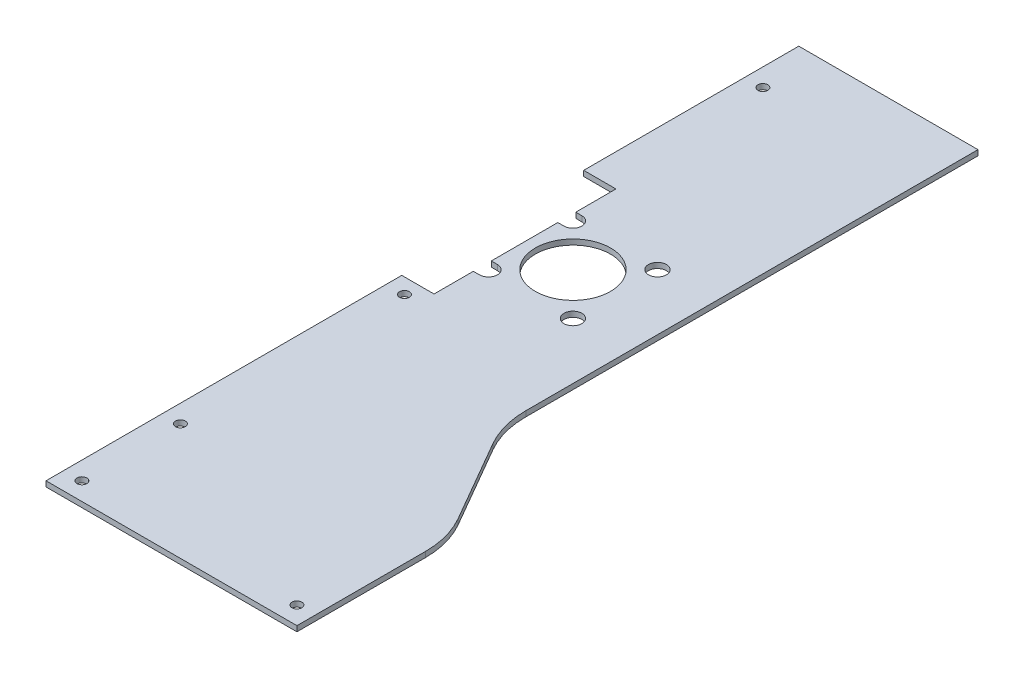
ISO-10303-21;
HEADER;
FILE_DESCRIPTION(('STEP AP214'),'2;1');
FILE_NAME('part.step','',(''),(''),'','','');
FILE_SCHEMA(('AUTOMOTIVE_DESIGN { 1 0 10303 214 1 1 1 1 }'));
ENDSEC;
DATA;
#1=APPLICATION_CONTEXT('core data for automotive mechanical design processes');
#2=APPLICATION_PROTOCOL_DEFINITION('international standard','automotive_design',2000,#1);
#3=PRODUCT_CONTEXT('',#1,'mechanical');
#4=PRODUCT('Part','Part','',(#3));
#5=PRODUCT_RELATED_PRODUCT_CATEGORY('part','',(#4));
#6=PRODUCT_DEFINITION_FORMATION('','',#4);
#7=PRODUCT_DEFINITION_CONTEXT('part definition',#1,'design');
#8=PRODUCT_DEFINITION('design','',#6,#7);
#9=PRODUCT_DEFINITION_SHAPE('','',#8);
#10=(LENGTH_UNIT() NAMED_UNIT(*) SI_UNIT(.MILLI.,.METRE.));
#11=(NAMED_UNIT(*) PLANE_ANGLE_UNIT() SI_UNIT($,.RADIAN.));
#12=(NAMED_UNIT(*) SI_UNIT($,.STERADIAN.) SOLID_ANGLE_UNIT());
#13=UNCERTAINTY_MEASURE_WITH_UNIT(LENGTH_MEASURE(1.E-05),#10,'distance_accuracy_value','');
#14=(GEOMETRIC_REPRESENTATION_CONTEXT(3) GLOBAL_UNCERTAINTY_ASSIGNED_CONTEXT((#13)) GLOBAL_UNIT_ASSIGNED_CONTEXT((#10,
#11,#12)) REPRESENTATION_CONTEXT('',''));
#15=CARTESIAN_POINT('',(0.,0.,0.));
#16=DIRECTION('',(0.,0.,1.));
#17=DIRECTION('',(1.,0.,0.));
#18=AXIS2_PLACEMENT_3D('',#15,#16,#17);
#19=CARTESIAN_POINT('',(95.6984536095886,39.4297055458415,20.3890320920176));
#20=DIRECTION('',(0.,1.,0.));
#21=DIRECTION('',(1.,0.,0.));
#22=AXIS2_PLACEMENT_3D('',#19,#20,#21);
#23=CYLINDRICAL_SURFACE('',#22,5.);
#24=CARTESIAN_POINT('',(95.6984536095886,42.4297055458415,20.3890320920176));
#25=DIRECTION('',(0.,1.,0.));
#26=DIRECTION('',(-1.,0.,0.));
#27=AXIS2_PLACEMENT_3D('',#24,#25,#26);
#28=CIRCLE('',#27,5.);
#29=CARTESIAN_POINT('',(95.6984536095886,42.4297055458415,25.3890320920178));
#30=VERTEX_POINT('',#29);
#31=CARTESIAN_POINT('',(95.6984536095886,42.4297055458415,15.3890320920174));
#32=VERTEX_POINT('',#31);
#33=EDGE_CURVE('E179',#30,#32,#28,.T.);
#34=ORIENTED_EDGE('',*,*,#33,.T.);
#35=DIRECTION('',(0.,-1.,0.));
#36=VECTOR('',#35,1.);
#37=CARTESIAN_POINT('',(95.6984536095886,42.4297055458415,15.3890320920174));
#38=LINE('',#37,#36);
#39=CARTESIAN_POINT('',(95.6984536095886,39.4297055458415,15.3890320920174));
#40=VERTEX_POINT('',#39);
#41=EDGE_CURVE('E840',#32,#40,#38,.T.);
#42=ORIENTED_EDGE('',*,*,#41,.T.);
#43=CARTESIAN_POINT('',(95.6984536095886,39.4297055458415,20.3890320920176));
#44=DIRECTION('',(0.,1.,0.));
#45=DIRECTION('',(-1.,0.,0.));
#46=AXIS2_PLACEMENT_3D('',#43,#44,#45);
#47=CIRCLE('',#46,5.);
#48=CARTESIAN_POINT('',(95.6984536095886,39.4297055458415,25.3890320920178));
#49=VERTEX_POINT('',#48);
#50=EDGE_CURVE('E313',#49,#40,#47,.T.);
#51=ORIENTED_EDGE('',*,*,#50,.F.);
#52=DIRECTION('',(0.,-1.,0.));
#53=VECTOR('',#52,1.);
#54=CARTESIAN_POINT('',(95.6984536095886,42.4297055458415,25.3890320920178));
#55=LINE('',#54,#53);
#56=EDGE_CURVE('E830',#30,#49,#55,.T.);
#57=ORIENTED_EDGE('',*,*,#56,.F.);
#58=EDGE_LOOP('',(#34,#42,#51,#57));
#59=FACE_BOUND('',#58,.T.);
#60=ADVANCED_FACE('F17',(#59),#23,.F.);
#61=CARTESIAN_POINT('',(95.6984536095886,39.4297055458415,67.5290320920176));
#62=DIRECTION('',(0.,1.,0.));
#63=DIRECTION('',(1.,0.,0.));
#64=AXIS2_PLACEMENT_3D('',#61,#62,#63);
#65=CYLINDRICAL_SURFACE('',#64,5.);
#66=CARTESIAN_POINT('',(95.6984536095886,42.4297055458415,67.5290320920176));
#67=DIRECTION('',(0.,1.,0.));
#68=DIRECTION('',(-1.,0.,0.));
#69=AXIS2_PLACEMENT_3D('',#66,#67,#68);
#70=CIRCLE('',#69,5.);
#71=CARTESIAN_POINT('',(95.6984536095886,42.4297055458415,72.5290320920177));
#72=VERTEX_POINT('',#71);
#73=CARTESIAN_POINT('',(95.6984536095886,42.4297055458415,62.5290320920175));
#74=VERTEX_POINT('',#73);
#75=EDGE_CURVE('E168',#72,#74,#70,.T.);
#76=ORIENTED_EDGE('',*,*,#75,.T.);
#77=DIRECTION('',(0.,-1.,0.));
#78=VECTOR('',#77,1.);
#79=CARTESIAN_POINT('',(95.6984536095886,42.4297055458415,62.5290320920175));
#80=LINE('',#79,#78);
#81=CARTESIAN_POINT('',(95.6984536095886,39.4297055458415,62.5290320920175));
#82=VERTEX_POINT('',#81);
#83=EDGE_CURVE('E41',#74,#82,#80,.T.);
#84=ORIENTED_EDGE('',*,*,#83,.T.);
#85=CARTESIAN_POINT('',(95.6984536095886,39.4297055458415,67.5290320920176));
#86=DIRECTION('',(0.,1.,0.));
#87=DIRECTION('',(-1.,0.,0.));
#88=AXIS2_PLACEMENT_3D('',#85,#86,#87);
#89=CIRCLE('',#88,5.);
#90=CARTESIAN_POINT('',(95.6984536095886,39.4297055458415,72.5290320920177));
#91=VERTEX_POINT('',#90);
#92=EDGE_CURVE('E170',#91,#82,#89,.T.);
#93=ORIENTED_EDGE('',*,*,#92,.F.);
#94=DIRECTION('',(0.,-1.,0.));
#95=VECTOR('',#94,1.);
#96=CARTESIAN_POINT('',(95.6984536095886,42.4297055458415,72.5290320920177));
#97=LINE('',#96,#95);
#98=EDGE_CURVE('E155',#72,#91,#97,.T.);
#99=ORIENTED_EDGE('',*,*,#98,.F.);
#100=EDGE_LOOP('',(#76,#84,#93,#99));
#101=FACE_BOUND('',#100,.T.);
#102=ADVANCED_FACE('F167',(#101),#65,.F.);
#103=CARTESIAN_POINT('',(204.268453609589,39.4297055458415,282.959032092008));
#104=DIRECTION('',(0.,1.,0.));
#105=DIRECTION('',(1.,0.,0.));
#106=AXIS2_PLACEMENT_3D('',#103,#104,#105);
#107=CYLINDRICAL_SURFACE('',#106,2.75);
#108=CARTESIAN_POINT('',(204.268453609589,39.4297055458415,282.959032092008));
#109=DIRECTION('',(0.,-1.,0.));
#110=DIRECTION('',(-1.,0.,0.));
#111=AXIS2_PLACEMENT_3D('',#108,#109,#110);
#112=CIRCLE('',#111,2.75);
#113=CARTESIAN_POINT('',(201.518453609589,39.4297055458415,282.959032092008));
#114=VERTEX_POINT('',#113);
#115=EDGE_CURVE('E859',#114,#114,#112,.T.);
#116=ORIENTED_EDGE('',*,*,#115,.T.);
#117=EDGE_LOOP('',(#116));
#118=FACE_BOUND('',#117,.T.);
#119=CARTESIAN_POINT('',(204.268453609589,42.4297055458415,282.959032092008));
#120=DIRECTION('',(0.,-1.,0.));
#121=DIRECTION('',(-1.,0.,0.));
#122=AXIS2_PLACEMENT_3D('',#119,#120,#121);
#123=CIRCLE('',#122,2.75);
#124=CARTESIAN_POINT('',(201.518453609589,42.4297055458415,282.959032092008));
#125=VERTEX_POINT('',#124);
#126=EDGE_CURVE('E845',#125,#125,#123,.T.);
#127=ORIENTED_EDGE('',*,*,#126,.F.);
#128=EDGE_LOOP('',(#127));
#129=FACE_BOUND('',#128,.T.);
#130=ADVANCED_FACE('F400',(#118,#129),#107,.F.);
#131=CARTESIAN_POINT('',(84.2684536095885,39.4297055458415,282.959032092008));
#132=DIRECTION('',(0.,1.,0.));
#133=DIRECTION('',(1.,0.,0.));
#134=AXIS2_PLACEMENT_3D('',#131,#132,#133);
#135=CYLINDRICAL_SURFACE('',#134,2.75);
#136=CARTESIAN_POINT('',(84.2684536095885,39.4297055458415,282.959032092008));
#137=DIRECTION('',(0.,-1.,0.));
#138=DIRECTION('',(-1.,0.,0.));
#139=AXIS2_PLACEMENT_3D('',#136,#137,#138);
#140=CIRCLE('',#139,2.75);
#141=CARTESIAN_POINT('',(81.5184536095885,39.4297055458415,282.959032092008));
#142=VERTEX_POINT('',#141);
#143=EDGE_CURVE('E867',#142,#142,#140,.T.);
#144=ORIENTED_EDGE('',*,*,#143,.T.);
#145=EDGE_LOOP('',(#144));
#146=FACE_BOUND('',#145,.T.);
#147=CARTESIAN_POINT('',(84.2684536095885,42.4297055458415,282.959032092008));
#148=DIRECTION('',(0.,-1.,0.));
#149=DIRECTION('',(-1.,0.,0.));
#150=AXIS2_PLACEMENT_3D('',#147,#148,#149);
#151=CIRCLE('',#150,2.75);
#152=CARTESIAN_POINT('',(81.5184536095885,42.4297055458415,282.959032092008));
#153=VERTEX_POINT('',#152);
#154=EDGE_CURVE('E863',#153,#153,#151,.T.);
#155=ORIENTED_EDGE('',*,*,#154,.F.);
#156=EDGE_LOOP('',(#155));
#157=FACE_BOUND('',#156,.T.);
#158=ADVANCED_FACE('F572',(#146,#157),#135,.F.);
#159=CARTESIAN_POINT('',(84.2684536095885,39.4297055458415,227.959032092009));
#160=DIRECTION('',(0.,1.,0.));
#161=DIRECTION('',(1.,0.,0.));
#162=AXIS2_PLACEMENT_3D('',#159,#160,#161);
#163=CYLINDRICAL_SURFACE('',#162,2.75);
#164=CARTESIAN_POINT('',(84.2684536095885,39.4297055458415,227.959032092009));
#165=DIRECTION('',(0.,-1.,0.));
#166=DIRECTION('',(-1.,0.,0.));
#167=AXIS2_PLACEMENT_3D('',#164,#165,#166);
#168=CIRCLE('',#167,2.75);
#169=CARTESIAN_POINT('',(81.5184536095885,39.4297055458415,227.959032092009));
#170=VERTEX_POINT('',#169);
#171=EDGE_CURVE('E875',#170,#170,#168,.T.);
#172=ORIENTED_EDGE('',*,*,#171,.T.);
#173=EDGE_LOOP('',(#172));
#174=FACE_BOUND('',#173,.T.);
#175=CARTESIAN_POINT('',(84.2684536095885,42.4297055458415,227.959032092009));
#176=DIRECTION('',(0.,-1.,0.));
#177=DIRECTION('',(-1.,0.,0.));
#178=AXIS2_PLACEMENT_3D('',#175,#176,#177);
#179=CIRCLE('',#178,2.75);
#180=CARTESIAN_POINT('',(81.5184536095885,42.4297055458415,227.959032092009));
#181=VERTEX_POINT('',#180);
#182=EDGE_CURVE('E871',#181,#181,#179,.T.);
#183=ORIENTED_EDGE('',*,*,#182,.F.);
#184=EDGE_LOOP('',(#183));
#185=FACE_BOUND('',#184,.T.);
#186=ADVANCED_FACE('F584',(#174,#185),#163,.F.);
#187=CARTESIAN_POINT('',(84.2684536095885,39.4297055458415,102.959032092009));
#188=DIRECTION('',(0.,1.,0.));
#189=DIRECTION('',(1.,0.,0.));
#190=AXIS2_PLACEMENT_3D('',#187,#188,#189);
#191=CYLINDRICAL_SURFACE('',#190,2.75);
#192=CARTESIAN_POINT('',(84.2684536095885,39.4297055458415,102.959032092009));
#193=DIRECTION('',(0.,-1.,0.));
#194=DIRECTION('',(-1.,0.,0.));
#195=AXIS2_PLACEMENT_3D('',#192,#193,#194);
#196=CIRCLE('',#195,2.75);
#197=CARTESIAN_POINT('',(81.5184536095885,39.4297055458415,102.959032092009));
#198=VERTEX_POINT('',#197);
#199=EDGE_CURVE('E883',#198,#198,#196,.T.);
#200=ORIENTED_EDGE('',*,*,#199,.T.);
#201=EDGE_LOOP('',(#200));
#202=FACE_BOUND('',#201,.T.);
#203=CARTESIAN_POINT('',(84.2684536095885,42.4297055458415,102.959032092009));
#204=DIRECTION('',(0.,-1.,0.));
#205=DIRECTION('',(-1.,0.,0.));
#206=AXIS2_PLACEMENT_3D('',#203,#204,#205);
#207=CIRCLE('',#206,2.75);
#208=CARTESIAN_POINT('',(81.5184536095885,42.4297055458415,102.959032092009));
#209=VERTEX_POINT('',#208);
#210=EDGE_CURVE('E879',#209,#209,#207,.T.);
#211=ORIENTED_EDGE('',*,*,#210,.F.);
#212=EDGE_LOOP('',(#211));
#213=FACE_BOUND('',#212,.T.);
#214=ADVANCED_FACE('F597',(#202,#213),#191,.F.);
#215=CARTESIAN_POINT('',(84.2684536095885,39.4297055458415,-97.0409679079914));
#216=DIRECTION('',(0.,1.,0.));
#217=DIRECTION('',(1.,0.,0.));
#218=AXIS2_PLACEMENT_3D('',#215,#216,#217);
#219=CYLINDRICAL_SURFACE('',#218,2.75000000000004);
#220=CARTESIAN_POINT('',(84.2684536095885,39.4297055458415,-97.0409679079914));
#221=DIRECTION('',(0.,-1.,0.));
#222=DIRECTION('',(-1.,0.,0.));
#223=AXIS2_PLACEMENT_3D('',#220,#221,#222);
#224=CIRCLE('',#223,2.75000000000004);
#225=CARTESIAN_POINT('',(81.5184536095885,39.4297055458415,-97.0409679079914));
#226=VERTEX_POINT('',#225);
#227=EDGE_CURVE('E891',#226,#226,#224,.T.);
#228=ORIENTED_EDGE('',*,*,#227,.T.);
#229=EDGE_LOOP('',(#228));
#230=FACE_BOUND('',#229,.T.);
#231=CARTESIAN_POINT('',(84.2684536095885,42.4297055458415,-97.0409679079914));
#232=DIRECTION('',(0.,-1.,0.));
#233=DIRECTION('',(-1.,0.,0.));
#234=AXIS2_PLACEMENT_3D('',#231,#232,#233);
#235=CIRCLE('',#234,2.75000000000004);
#236=CARTESIAN_POINT('',(81.5184536095885,42.4297055458415,-97.0409679079914));
#237=VERTEX_POINT('',#236);
#238=EDGE_CURVE('E887',#237,#237,#235,.T.);
#239=ORIENTED_EDGE('',*,*,#238,.F.);
#240=EDGE_LOOP('',(#239));
#241=FACE_BOUND('',#240,.T.);
#242=ADVANCED_FACE('F610',(#230,#241),#219,.F.);
#243=CARTESIAN_POINT('',(142.838453609589,39.4297055458415,20.3890320920176));
#244=DIRECTION('',(0.,1.,0.));
#245=DIRECTION('',(1.,0.,0.));
#246=AXIS2_PLACEMENT_3D('',#243,#244,#245);
#247=CYLINDRICAL_SURFACE('',#246,5.);
#248=CARTESIAN_POINT('',(142.838453609589,39.4297055458415,20.3890320920176));
#249=DIRECTION('',(0.,-1.,0.));
#250=DIRECTION('',(-1.,0.,0.));
#251=AXIS2_PLACEMENT_3D('',#248,#249,#250);
#252=CIRCLE('',#251,5.);
#253=CARTESIAN_POINT('',(137.838453609589,39.4297055458415,20.3890320920176));
#254=VERTEX_POINT('',#253);
#255=EDGE_CURVE('E899',#254,#254,#252,.T.);
#256=ORIENTED_EDGE('',*,*,#255,.T.);
#257=EDGE_LOOP('',(#256));
#258=FACE_BOUND('',#257,.T.);
#259=CARTESIAN_POINT('',(142.838453609589,42.4297055458415,20.3890320920176));
#260=DIRECTION('',(0.,-1.,0.));
#261=DIRECTION('',(-1.,0.,0.));
#262=AXIS2_PLACEMENT_3D('',#259,#260,#261);
#263=CIRCLE('',#262,5.);
#264=CARTESIAN_POINT('',(137.838453609589,42.4297055458415,20.3890320920176));
#265=VERTEX_POINT('',#264);
#266=EDGE_CURVE('E895',#265,#265,#263,.T.);
#267=ORIENTED_EDGE('',*,*,#266,.F.);
#268=EDGE_LOOP('',(#267));
#269=FACE_BOUND('',#268,.T.);
#270=ADVANCED_FACE('F622',(#258,#269),#247,.F.);
#271=CARTESIAN_POINT('',(142.838453609589,39.4297055458415,67.5290320920176));
#272=DIRECTION('',(0.,1.,0.));
#273=DIRECTION('',(1.,0.,0.));
#274=AXIS2_PLACEMENT_3D('',#271,#272,#273);
#275=CYLINDRICAL_SURFACE('',#274,5.);
#276=CARTESIAN_POINT('',(142.838453609589,39.4297055458415,67.5290320920176));
#277=DIRECTION('',(0.,-1.,0.));
#278=DIRECTION('',(-1.,0.,0.));
#279=AXIS2_PLACEMENT_3D('',#276,#277,#278);
#280=CIRCLE('',#279,5.);
#281=CARTESIAN_POINT('',(137.838453609589,39.4297055458415,67.5290320920176));
#282=VERTEX_POINT('',#281);
#283=EDGE_CURVE('E907',#282,#282,#280,.T.);
#284=ORIENTED_EDGE('',*,*,#283,.T.);
#285=EDGE_LOOP('',(#284));
#286=FACE_BOUND('',#285,.T.);
#287=CARTESIAN_POINT('',(142.838453609589,42.4297055458415,67.5290320920176));
#288=DIRECTION('',(0.,-1.,0.));
#289=DIRECTION('',(-1.,0.,0.));
#290=AXIS2_PLACEMENT_3D('',#287,#288,#289);
#291=CIRCLE('',#290,5.);
#292=CARTESIAN_POINT('',(137.838453609589,42.4297055458415,67.5290320920176));
#293=VERTEX_POINT('',#292);
#294=EDGE_CURVE('E903',#293,#293,#291,.T.);
#295=ORIENTED_EDGE('',*,*,#294,.F.);
#296=EDGE_LOOP('',(#295));
#297=FACE_BOUND('',#296,.T.);
#298=ADVANCED_FACE('F633',(#286,#297),#275,.F.);
#299=CARTESIAN_POINT('',(119.268453609589,39.4297055458415,43.9590320920176));
#300=DIRECTION('',(0.,1.,0.));
#301=DIRECTION('',(1.,0.,0.));
#302=AXIS2_PLACEMENT_3D('',#299,#300,#301);
#303=CYLINDRICAL_SURFACE('',#302,21.);
#304=CARTESIAN_POINT('',(119.268453609589,39.4297055458415,43.9590320920176));
#305=DIRECTION('',(0.,-1.,0.));
#306=DIRECTION('',(-1.,0.,0.));
#307=AXIS2_PLACEMENT_3D('',#304,#305,#306);
#308=CIRCLE('',#307,21.);
#309=CARTESIAN_POINT('',(98.2684536095886,39.4297055458415,43.9590320920176));
#310=VERTEX_POINT('',#309);
#311=EDGE_CURVE('E258',#310,#310,#308,.T.);
#312=ORIENTED_EDGE('',*,*,#311,.T.);
#313=EDGE_LOOP('',(#312));
#314=FACE_BOUND('',#313,.T.);
#315=CARTESIAN_POINT('',(119.268453609589,42.4297055458415,43.9590320920176));
#316=DIRECTION('',(0.,-1.,0.));
#317=DIRECTION('',(-1.,0.,0.));
#318=AXIS2_PLACEMENT_3D('',#315,#316,#317);
#319=CIRCLE('',#318,21.);
#320=CARTESIAN_POINT('',(98.2684536095886,42.4297055458415,43.9590320920176));
#321=VERTEX_POINT('',#320);
#322=EDGE_CURVE('E266',#321,#321,#319,.T.);
#323=ORIENTED_EDGE('',*,*,#322,.F.);
#324=EDGE_LOOP('',(#323));
#325=FACE_BOUND('',#324,.T.);
#326=ADVANCED_FACE('F645',(#314,#325),#303,.F.);
#327=CARTESIAN_POINT('',(92.2684536095885,39.4297055458415,-7.04096790799141));
#328=DIRECTION('',(0.,0.,-1.));
#329=DIRECTION('',(1.,0.,0.));
#330=AXIS2_PLACEMENT_3D('',#327,#328,#329);
#331=PLANE('',#330);
#332=DIRECTION('',(-1.,0.,0.));
#333=VECTOR('',#332,1.);
#334=CARTESIAN_POINT('',(92.2684536095885,42.4297055458415,-7.04096790799141));
#335=LINE('',#334,#333);
#336=CARTESIAN_POINT('',(92.2684536095885,42.4297055458415,-7.04096790799141));
#337=VERTEX_POINT('',#336);
#338=CARTESIAN_POINT('',(74.2684536095886,42.4297055458415,-7.04096790799141));
#339=VERTEX_POINT('',#338);
#340=EDGE_CURVE('E189',#337,#339,#335,.T.);
#341=ORIENTED_EDGE('',*,*,#340,.T.);
#342=DIRECTION('',(0.,1.,0.));
#343=VECTOR('',#342,1.);
#344=CARTESIAN_POINT('',(74.2684536095886,39.4297055458415,-7.04096790799141));
#345=LINE('',#344,#343);
#346=CARTESIAN_POINT('',(74.2684536095886,39.4297055458415,-7.04096790799141));
#347=VERTEX_POINT('',#346);
#348=EDGE_CURVE('E193',#347,#339,#345,.T.);
#349=ORIENTED_EDGE('',*,*,#348,.F.);
#350=DIRECTION('',(-1.,0.,0.));
#351=VECTOR('',#350,1.);
#352=CARTESIAN_POINT('',(92.2684536095885,39.4297055458415,-7.04096790799141));
#353=LINE('',#352,#351);
#354=CARTESIAN_POINT('',(92.2684536095885,39.4297055458415,-7.04096790799141));
#355=VERTEX_POINT('',#354);
#356=EDGE_CURVE('E198',#355,#347,#353,.T.);
#357=ORIENTED_EDGE('',*,*,#356,.F.);
#358=DIRECTION('',(0.,1.,0.));
#359=VECTOR('',#358,1.);
#360=CARTESIAN_POINT('',(92.2684536095885,39.4297055458415,-7.04096790799141));
#361=LINE('',#360,#359);
#362=EDGE_CURVE('E197',#355,#337,#361,.T.);
#363=ORIENTED_EDGE('',*,*,#362,.T.);
#364=EDGE_LOOP('',(#341,#349,#357,#363));
#365=FACE_BOUND('',#364,.T.);
#366=ADVANCED_FACE('F326',(#365),#331,.F.);
#367=CARTESIAN_POINT('',(92.2684536095885,39.4297055458415,16.7510243954891));
#368=DIRECTION('',(1.,0.,0.));
#369=DIRECTION('',(0.,-1.,0.));
#370=AXIS2_PLACEMENT_3D('',#367,#368,#369);
#371=PLANE('',#370);
#372=DIRECTION('',(0.,0.,-1.));
#373=VECTOR('',#372,1.);
#374=CARTESIAN_POINT('',(92.2684536095885,39.4297055458415,16.7510243954891));
#375=LINE('',#374,#373);
#376=CARTESIAN_POINT('',(92.2684536095885,39.4297055458415,15.3890320920174));
#377=VERTEX_POINT('',#376);
#378=EDGE_CURVE('E315',#377,#355,#375,.T.);
#379=ORIENTED_EDGE('',*,*,#378,.F.);
#380=DIRECTION('',(0.,-1.,0.));
#381=VECTOR('',#380,1.);
#382=CARTESIAN_POINT('',(92.2684536095885,42.4297055458415,15.3890320920174));
#383=LINE('',#382,#381);
#384=CARTESIAN_POINT('',(92.2684536095885,42.4297055458415,15.3890320920174));
#385=VERTEX_POINT('',#384);
#386=EDGE_CURVE('E836',#385,#377,#383,.T.);
#387=ORIENTED_EDGE('',*,*,#386,.F.);
#388=DIRECTION('',(0.,0.,-1.));
#389=VECTOR('',#388,1.);
#390=CARTESIAN_POINT('',(92.2684536095885,42.4297055458415,16.7510243954891));
#391=LINE('',#390,#389);
#392=EDGE_CURVE('E187',#385,#337,#391,.T.);
#393=ORIENTED_EDGE('',*,*,#392,.T.);
#394=ORIENTED_EDGE('',*,*,#362,.F.);
#395=EDGE_LOOP('',(#379,#387,#393,#394));
#396=FACE_BOUND('',#395,.T.);
#397=ADVANCED_FACE('F404',(#396),#371,.F.);
#398=CARTESIAN_POINT('',(92.2684536095885,39.4297055458415,63.8910243954891));
#399=DIRECTION('',(1.,0.,0.));
#400=DIRECTION('',(0.,-1.,0.));
#401=AXIS2_PLACEMENT_3D('',#398,#399,#400);
#402=PLANE('',#401);
#403=DIRECTION('',(0.,0.,-1.));
#404=VECTOR('',#403,1.);
#405=CARTESIAN_POINT('',(92.2684536095885,39.4297055458415,63.8910243954891));
#406=LINE('',#405,#404);
#407=CARTESIAN_POINT('',(92.2684536095885,39.4297055458415,62.5290320920175));
#408=VERTEX_POINT('',#407);
#409=CARTESIAN_POINT('',(92.2684536095885,39.4297055458415,25.3890320920178));
#410=VERTEX_POINT('',#409);
#411=EDGE_CURVE('E304',#408,#410,#406,.T.);
#412=ORIENTED_EDGE('',*,*,#411,.F.);
#413=DIRECTION('',(0.,-1.,0.));
#414=VECTOR('',#413,1.);
#415=CARTESIAN_POINT('',(92.2684536095885,42.4297055458415,62.5290320920175));
#416=LINE('',#415,#414);
#417=CARTESIAN_POINT('',(92.2684536095885,42.4297055458415,62.5290320920175));
#418=VERTEX_POINT('',#417);
#419=EDGE_CURVE('E846',#418,#408,#416,.T.);
#420=ORIENTED_EDGE('',*,*,#419,.F.);
#421=DIRECTION('',(0.,0.,-1.));
#422=VECTOR('',#421,1.);
#423=CARTESIAN_POINT('',(92.2684536095885,42.4297055458415,63.8910243954891));
#424=LINE('',#423,#422);
#425=CARTESIAN_POINT('',(92.2684536095885,42.4297055458415,25.3890320920178));
#426=VERTEX_POINT('',#425);
#427=EDGE_CURVE('E175',#418,#426,#424,.T.);
#428=ORIENTED_EDGE('',*,*,#427,.T.);
#429=DIRECTION('',(0.,-1.,0.));
#430=VECTOR('',#429,1.);
#431=CARTESIAN_POINT('',(92.2684536095885,42.4297055458415,25.3890320920178));
#432=LINE('',#431,#430);
#433=EDGE_CURVE('E827',#426,#410,#432,.T.);
#434=ORIENTED_EDGE('',*,*,#433,.T.);
#435=EDGE_LOOP('',(#412,#420,#428,#434));
#436=FACE_BOUND('',#435,.T.);
#437=ADVANCED_FACE('F406',(#436),#402,.F.);
#438=CARTESIAN_POINT('',(92.2684536095885,39.4297055458415,94.4590320920086));
#439=DIRECTION('',(1.,0.,0.));
#440=DIRECTION('',(0.,-1.,0.));
#441=AXIS2_PLACEMENT_3D('',#438,#439,#440);
#442=PLANE('',#441);
#443=DIRECTION('',(0.,0.,-1.));
#444=VECTOR('',#443,1.);
#445=CARTESIAN_POINT('',(92.2684536095885,42.4297055458415,94.4590320920086));
#446=LINE('',#445,#444);
#447=CARTESIAN_POINT('',(92.2684536095885,42.4297055458415,94.4590320920086));
#448=VERTEX_POINT('',#447);
#449=CARTESIAN_POINT('',(92.2684536095885,42.4297055458415,72.5290320920177));
#450=VERTEX_POINT('',#449);
#451=EDGE_CURVE('E176',#448,#450,#446,.T.);
#452=ORIENTED_EDGE('',*,*,#451,.T.);
#453=DIRECTION('',(0.,-1.,0.));
#454=VECTOR('',#453,1.);
#455=CARTESIAN_POINT('',(92.2684536095885,42.4297055458415,72.5290320920177));
#456=LINE('',#455,#454);
#457=CARTESIAN_POINT('',(92.2684536095885,39.4297055458415,72.5290320920177));
#458=VERTEX_POINT('',#457);
#459=EDGE_CURVE('E33',#450,#458,#456,.T.);
#460=ORIENTED_EDGE('',*,*,#459,.T.);
#461=DIRECTION('',(0.,0.,-1.));
#462=VECTOR('',#461,1.);
#463=CARTESIAN_POINT('',(92.2684536095885,39.4297055458415,94.4590320920086));
#464=LINE('',#463,#462);
#465=CARTESIAN_POINT('',(92.2684536095885,39.4297055458415,94.4590320920086));
#466=VERTEX_POINT('',#465);
#467=EDGE_CURVE('E300',#466,#458,#464,.T.);
#468=ORIENTED_EDGE('',*,*,#467,.F.);
#469=DIRECTION('',(0.,1.,0.));
#470=VECTOR('',#469,1.);
#471=CARTESIAN_POINT('',(92.2684536095885,39.4297055458415,94.4590320920086));
#472=LINE('',#471,#470);
#473=EDGE_CURVE('E202',#466,#448,#472,.T.);
#474=ORIENTED_EDGE('',*,*,#473,.T.);
#475=EDGE_LOOP('',(#452,#460,#468,#474));
#476=FACE_BOUND('',#475,.T.);
#477=ADVANCED_FACE('F298',(#476),#442,.F.);
#478=CARTESIAN_POINT('',(74.2684536095886,39.4297055458415,94.4590320920086));
#479=DIRECTION('',(0.,0.,1.));
#480=DIRECTION('',(-1.,0.,0.));
#481=AXIS2_PLACEMENT_3D('',#478,#479,#480);
#482=PLANE('',#481);
#483=DIRECTION('',(1.,0.,0.));
#484=VECTOR('',#483,1.);
#485=CARTESIAN_POINT('',(74.2684536095886,42.4297055458415,94.4590320920086));
#486=LINE('',#485,#484);
#487=CARTESIAN_POINT('',(74.2684536095886,42.4297055458415,94.4590320920086));
#488=VERTEX_POINT('',#487);
#489=EDGE_CURVE('E181',#488,#448,#486,.T.);
#490=ORIENTED_EDGE('',*,*,#489,.T.);
#491=ORIENTED_EDGE('',*,*,#473,.F.);
#492=DIRECTION('',(1.,0.,0.));
#493=VECTOR('',#492,1.);
#494=CARTESIAN_POINT('',(74.2684536095886,39.4297055458415,94.4590320920086));
#495=LINE('',#494,#493);
#496=CARTESIAN_POINT('',(74.2684536095886,39.4297055458415,94.4590320920086));
#497=VERTEX_POINT('',#496);
#498=EDGE_CURVE('E302',#497,#466,#495,.T.);
#499=ORIENTED_EDGE('',*,*,#498,.F.);
#500=DIRECTION('',(0.,1.,0.));
#501=VECTOR('',#500,1.);
#502=CARTESIAN_POINT('',(74.2684536095886,39.4297055458415,94.4590320920086));
#503=LINE('',#502,#501);
#504=EDGE_CURVE('E206',#497,#488,#503,.T.);
#505=ORIENTED_EDGE('',*,*,#504,.T.);
#506=EDGE_LOOP('',(#490,#491,#499,#505));
#507=FACE_BOUND('',#506,.T.);
#508=ADVANCED_FACE('F293',(#507),#482,.F.);
#509=CARTESIAN_POINT('',(74.2684536095886,39.4297055458415,292.959032092008));
#510=DIRECTION('',(1.,0.,0.));
#511=DIRECTION('',(0.,-1.,0.));
#512=AXIS2_PLACEMENT_3D('',#509,#510,#511);
#513=PLANE('',#512);
#514=DIRECTION('',(0.,1.,0.));
#515=VECTOR('',#514,1.);
#516=CARTESIAN_POINT('',(74.2684536095886,39.4297055458415,292.959032092008));
#517=LINE('',#516,#515);
#518=CARTESIAN_POINT('',(74.2684536095886,39.4297055458415,292.959032092008));
#519=VERTEX_POINT('',#518);
#520=CARTESIAN_POINT('',(74.2684536095886,42.4297055458415,292.959032092008));
#521=VERTEX_POINT('',#520);
#522=EDGE_CURVE('E210',#519,#521,#517,.T.);
#523=ORIENTED_EDGE('',*,*,#522,.T.);
#524=DIRECTION('',(0.,0.,-1.));
#525=VECTOR('',#524,1.);
#526=CARTESIAN_POINT('',(74.2684536095886,42.4297055458415,292.959032092008));
#527=LINE('',#526,#525);
#528=EDGE_CURVE('E286',#521,#488,#527,.T.);
#529=ORIENTED_EDGE('',*,*,#528,.T.);
#530=ORIENTED_EDGE('',*,*,#504,.F.);
#531=DIRECTION('',(0.,0.,-1.));
#532=VECTOR('',#531,1.);
#533=CARTESIAN_POINT('',(74.2684536095886,39.4297055458415,292.959032092008));
#534=LINE('',#533,#532);
#535=EDGE_CURVE('E307',#519,#497,#534,.T.);
#536=ORIENTED_EDGE('',*,*,#535,.F.);
#537=EDGE_LOOP('',(#523,#529,#530,#536));
#538=FACE_BOUND('',#537,.T.);
#539=ADVANCED_FACE('F19',(#538),#513,.F.);
#540=CARTESIAN_POINT('',(214.268453609588,39.4297055458415,292.959032092008));
#541=DIRECTION('',(0.,0.,-1.));
#542=DIRECTION('',(1.,0.,0.));
#543=AXIS2_PLACEMENT_3D('',#540,#541,#542);
#544=PLANE('',#543);
#545=DIRECTION('',(0.,1.,0.));
#546=VECTOR('',#545,1.);
#547=CARTESIAN_POINT('',(214.268453609588,39.4297055458415,292.959032092008));
#548=LINE('',#547,#546);
#549=CARTESIAN_POINT('',(214.268453609588,39.4297055458415,292.959032092008));
#550=VERTEX_POINT('',#549);
#551=CARTESIAN_POINT('',(214.268453609588,42.4297055458415,292.959032092008));
#552=VERTEX_POINT('',#551);
#553=EDGE_CURVE('E214',#550,#552,#548,.T.);
#554=ORIENTED_EDGE('',*,*,#553,.T.);
#555=DIRECTION('',(-1.,0.,0.));
#556=VECTOR('',#555,1.);
#557=CARTESIAN_POINT('',(214.268453609588,42.4297055458415,292.959032092008));
#558=LINE('',#557,#556);
#559=EDGE_CURVE('E11',#552,#521,#558,.T.);
#560=ORIENTED_EDGE('',*,*,#559,.T.);
#561=ORIENTED_EDGE('',*,*,#522,.F.);
#562=DIRECTION('',(-1.,0.,0.));
#563=VECTOR('',#562,1.);
#564=CARTESIAN_POINT('',(214.268453609588,39.4297055458415,292.959032092008));
#565=LINE('',#564,#563);
#566=EDGE_CURVE('E348',#550,#519,#565,.T.);
#567=ORIENTED_EDGE('',*,*,#566,.F.);
#568=EDGE_LOOP('',(#554,#560,#561,#567));
#569=FACE_BOUND('',#568,.T.);
#570=ADVANCED_FACE('F360',(#569),#544,.F.);
#571=CARTESIAN_POINT('',(214.268453609588,39.4297055458415,221.356491713565));
#572=DIRECTION('',(-1.,0.,0.));
#573=DIRECTION('',(0.,0.,-1.));
#574=AXIS2_PLACEMENT_3D('',#571,#572,#573);
#575=PLANE('',#574);
#576=DIRECTION('',(0.,0.,1.));
#577=VECTOR('',#576,1.);
#578=CARTESIAN_POINT('',(214.268453609588,42.4297055458415,221.356491713565));
#579=LINE('',#578,#577);
#580=CARTESIAN_POINT('',(214.268453609588,42.4297055458415,221.356491713565));
#581=VERTEX_POINT('',#580);
#582=EDGE_CURVE('E282',#581,#552,#579,.T.);
#583=ORIENTED_EDGE('',*,*,#582,.T.);
#584=ORIENTED_EDGE('',*,*,#553,.F.);
#585=DIRECTION('',(0.,0.,1.));
#586=VECTOR('',#585,1.);
#587=CARTESIAN_POINT('',(214.268453609588,39.4297055458415,221.356491713565));
#588=LINE('',#587,#586);
#589=CARTESIAN_POINT('',(214.268453609588,39.4297055458415,221.356491713565));
#590=VERTEX_POINT('',#589);
#591=EDGE_CURVE('E345',#590,#550,#588,.T.);
#592=ORIENTED_EDGE('',*,*,#591,.F.);
#593=DIRECTION('',(0.,1.,0.));
#594=VECTOR('',#593,1.);
#595=CARTESIAN_POINT('',(214.268453609588,39.4297055458415,221.356491713565));
#596=LINE('',#595,#594);
#597=EDGE_CURVE('E218',#590,#581,#596,.T.);
#598=ORIENTED_EDGE('',*,*,#597,.T.);
#599=EDGE_LOOP('',(#583,#584,#592,#598));
#600=FACE_BOUND('',#599,.T.);
#601=ADVANCED_FACE('F363',(#600),#575,.F.);
#602=CARTESIAN_POINT('',(164.268453609589,39.4297055458415,221.356491713565));
#603=DIRECTION('',(0.,1.,0.));
#604=DIRECTION('',(1.,0.,0.));
#605=AXIS2_PLACEMENT_3D('',#602,#603,#604);
#606=CYLINDRICAL_SURFACE('',#605,50.);
#607=CARTESIAN_POINT('',(164.268453609589,42.4297055458415,221.356491713565));
#608=DIRECTION('',(0.,-1.,0.));
#609=DIRECTION('',(1.,0.,0.));
#610=AXIS2_PLACEMENT_3D('',#607,#608,#609);
#611=CIRCLE('',#610,50.);
#612=CARTESIAN_POINT('',(207.56972379881,42.4297055458415,196.356491713565));
#613=VERTEX_POINT('',#612);
#614=EDGE_CURVE('E279',#613,#581,#611,.T.);
#615=ORIENTED_EDGE('',*,*,#614,.T.);
#616=ORIENTED_EDGE('',*,*,#597,.F.);
#617=CARTESIAN_POINT('',(164.268453609589,39.4297055458415,221.356491713565));
#618=DIRECTION('',(0.,-1.,0.));
#619=DIRECTION('',(1.,0.,0.));
#620=AXIS2_PLACEMENT_3D('',#617,#618,#619);
#621=CIRCLE('',#620,50.);
#622=CARTESIAN_POINT('',(207.56972379881,39.4297055458415,196.356491713565));
#623=VERTEX_POINT('',#622);
#624=EDGE_CURVE('E342',#623,#590,#621,.T.);
#625=ORIENTED_EDGE('',*,*,#624,.F.);
#626=DIRECTION('',(0.,1.,0.));
#627=VECTOR('',#626,1.);
#628=CARTESIAN_POINT('',(207.56972379881,39.4297055458415,196.356491713565));
#629=LINE('',#628,#627);
#630=EDGE_CURVE('E222',#623,#613,#629,.T.);
#631=ORIENTED_EDGE('',*,*,#630,.T.);
#632=EDGE_LOOP('',(#615,#616,#625,#631));
#633=FACE_BOUND('',#632,.T.);
#634=ADVANCED_FACE('F367',(#633),#606,.T.);
#635=CARTESIAN_POINT('',(180.967183420366,39.4297055458415,150.279540167697));
#636=DIRECTION('',(-0.866025403784438,0.,0.5));
#637=DIRECTION('',(-0.5,0.,-0.866025403784438));
#638=AXIS2_PLACEMENT_3D('',#635,#636,#637);
#639=PLANE('',#638);
#640=DIRECTION('',(0.5,0.,0.866025403784438));
#641=VECTOR('',#640,1.);
#642=CARTESIAN_POINT('',(180.967183420366,42.4297055458415,150.279540167697));
#643=LINE('',#642,#641);
#644=CARTESIAN_POINT('',(180.967183420366,42.4297055458415,150.279540167697));
#645=VERTEX_POINT('',#644);
#646=EDGE_CURVE('E276',#645,#613,#643,.T.);
#647=ORIENTED_EDGE('',*,*,#646,.T.);
#648=ORIENTED_EDGE('',*,*,#630,.F.);
#649=DIRECTION('',(0.5,0.,0.866025403784438));
#650=VECTOR('',#649,1.);
#651=CARTESIAN_POINT('',(180.967183420366,39.4297055458415,150.279540167697));
#652=LINE('',#651,#650);
#653=CARTESIAN_POINT('',(180.967183420366,39.4297055458415,150.279540167697));
#654=VERTEX_POINT('',#653);
#655=EDGE_CURVE('E339',#654,#623,#652,.T.);
#656=ORIENTED_EDGE('',*,*,#655,.F.);
#657=DIRECTION('',(0.,1.,0.));
#658=VECTOR('',#657,1.);
#659=CARTESIAN_POINT('',(180.967183420366,39.4297055458415,150.279540167697));
#660=LINE('',#659,#658);
#661=EDGE_CURVE('E226',#654,#645,#660,.T.);
#662=ORIENTED_EDGE('',*,*,#661,.T.);
#663=EDGE_LOOP('',(#647,#648,#656,#662));
#664=FACE_BOUND('',#663,.T.);
#665=ADVANCED_FACE('F373',(#664),#639,.F.);
#666=CARTESIAN_POINT('',(224.268453609589,39.4297055458415,125.279540167697));
#667=DIRECTION('',(0.,1.,0.));
#668=DIRECTION('',(1.,0.,0.));
#669=AXIS2_PLACEMENT_3D('',#666,#667,#668);
#670=CYLINDRICAL_SURFACE('',#669,50.);
#671=CARTESIAN_POINT('',(224.268453609589,42.4297055458415,125.279540167697));
#672=DIRECTION('',(0.,1.,0.));
#673=DIRECTION('',(-1.,0.,0.));
#674=AXIS2_PLACEMENT_3D('',#671,#672,#673);
#675=CIRCLE('',#674,50.);
#676=CARTESIAN_POINT('',(174.268453609589,42.4297055458415,125.279540167698));
#677=VERTEX_POINT('',#676);
#678=EDGE_CURVE('E273',#677,#645,#675,.T.);
#679=ORIENTED_EDGE('',*,*,#678,.T.);
#680=ORIENTED_EDGE('',*,*,#661,.F.);
#681=CARTESIAN_POINT('',(224.268453609589,39.4297055458415,125.279540167697));
#682=DIRECTION('',(0.,1.,0.));
#683=DIRECTION('',(-1.,0.,0.));
#684=AXIS2_PLACEMENT_3D('',#681,#682,#683);
#685=CIRCLE('',#684,50.);
#686=CARTESIAN_POINT('',(174.268453609589,39.4297055458415,125.279540167698));
#687=VERTEX_POINT('',#686);
#688=EDGE_CURVE('E337',#687,#654,#685,.T.);
#689=ORIENTED_EDGE('',*,*,#688,.F.);
#690=DIRECTION('',(0.,1.,0.));
#691=VECTOR('',#690,1.);
#692=CARTESIAN_POINT('',(174.268453609589,39.4297055458415,125.279540167698));
#693=LINE('',#692,#691);
#694=EDGE_CURVE('E230',#687,#677,#693,.T.);
#695=ORIENTED_EDGE('',*,*,#694,.T.);
#696=EDGE_LOOP('',(#679,#680,#689,#695));
#697=FACE_BOUND('',#696,.T.);
#698=ADVANCED_FACE('F378',(#697),#670,.F.);
#699=CARTESIAN_POINT('',(174.268453609589,39.4297055458415,-127.040967907991));
#700=DIRECTION('',(-1.,0.,0.));
#701=DIRECTION('',(0.,0.,-1.));
#702=AXIS2_PLACEMENT_3D('',#699,#700,#701);
#703=PLANE('',#702);
#704=DIRECTION('',(0.,0.,1.));
#705=VECTOR('',#704,1.);
#706=CARTESIAN_POINT('',(174.268453609589,42.4297055458415,-127.040967907991));
#707=LINE('',#706,#705);
#708=CARTESIAN_POINT('',(174.268453609589,42.4297055458415,-127.040967907991));
#709=VERTEX_POINT('',#708);
#710=EDGE_CURVE('E262',#709,#677,#707,.T.);
#711=ORIENTED_EDGE('',*,*,#710,.T.);
#712=ORIENTED_EDGE('',*,*,#694,.F.);
#713=DIRECTION('',(0.,0.,1.));
#714=VECTOR('',#713,1.);
#715=CARTESIAN_POINT('',(174.268453609589,39.4297055458415,-127.040967907991));
#716=LINE('',#715,#714);
#717=CARTESIAN_POINT('',(174.268453609589,39.4297055458415,-127.040967907991));
#718=VERTEX_POINT('',#717);
#719=EDGE_CURVE('E331',#718,#687,#716,.T.);
#720=ORIENTED_EDGE('',*,*,#719,.F.);
#721=DIRECTION('',(0.,1.,0.));
#722=VECTOR('',#721,1.);
#723=CARTESIAN_POINT('',(174.268453609589,39.4297055458415,-127.040967907991));
#724=LINE('',#723,#722);
#725=EDGE_CURVE('E234',#718,#709,#724,.T.);
#726=ORIENTED_EDGE('',*,*,#725,.T.);
#727=EDGE_LOOP('',(#711,#712,#720,#726));
#728=FACE_BOUND('',#727,.T.);
#729=ADVANCED_FACE('F382',(#728),#703,.F.);
#730=CARTESIAN_POINT('',(74.2684536095886,39.4297055458415,-127.040967907991));
#731=DIRECTION('',(0.,0.,1.));
#732=DIRECTION('',(-1.,0.,0.));
#733=AXIS2_PLACEMENT_3D('',#730,#731,#732);
#734=PLANE('',#733);
#735=DIRECTION('',(1.,0.,0.));
#736=VECTOR('',#735,1.);
#737=CARTESIAN_POINT('',(74.2684536095886,42.4297055458415,-127.040967907991));
#738=LINE('',#737,#736);
#739=CARTESIAN_POINT('',(74.2684536095886,42.4297055458415,-127.040967907991));
#740=VERTEX_POINT('',#739);
#741=EDGE_CURVE('E247',#740,#709,#738,.T.);
#742=ORIENTED_EDGE('',*,*,#741,.T.);
#743=ORIENTED_EDGE('',*,*,#725,.F.);
#744=DIRECTION('',(1.,0.,0.));
#745=VECTOR('',#744,1.);
#746=CARTESIAN_POINT('',(74.2684536095886,39.4297055458415,-127.040967907991));
#747=LINE('',#746,#745);
#748=CARTESIAN_POINT('',(74.2684536095886,39.4297055458415,-127.040967907991));
#749=VERTEX_POINT('',#748);
#750=EDGE_CURVE('E248',#749,#718,#747,.T.);
#751=ORIENTED_EDGE('',*,*,#750,.F.);
#752=DIRECTION('',(0.,1.,0.));
#753=VECTOR('',#752,1.);
#754=CARTESIAN_POINT('',(74.2684536095886,39.4297055458415,-127.040967907991));
#755=LINE('',#754,#753);
#756=EDGE_CURVE('E26',#749,#740,#755,.T.);
#757=ORIENTED_EDGE('',*,*,#756,.T.);
#758=EDGE_LOOP('',(#742,#743,#751,#757));
#759=FACE_BOUND('',#758,.T.);
#760=ADVANCED_FACE('F245',(#759),#734,.F.);
#761=CARTESIAN_POINT('',(74.2684536095886,39.4297055458415,-7.04096790799141));
#762=DIRECTION('',(1.,0.,0.));
#763=DIRECTION('',(0.,-1.,0.));
#764=AXIS2_PLACEMENT_3D('',#761,#762,#763);
#765=PLANE('',#764);
#766=DIRECTION('',(0.,0.,-1.));
#767=VECTOR('',#766,1.);
#768=CARTESIAN_POINT('',(74.2684536095886,42.4297055458415,-7.04096790799141));
#769=LINE('',#768,#767);
#770=EDGE_CURVE('E253',#339,#740,#769,.T.);
#771=ORIENTED_EDGE('',*,*,#770,.T.);
#772=ORIENTED_EDGE('',*,*,#756,.F.);
#773=DIRECTION('',(0.,0.,-1.));
#774=VECTOR('',#773,1.);
#775=CARTESIAN_POINT('',(74.2684536095886,39.4297055458415,-7.04096790799141));
#776=LINE('',#775,#774);
#777=EDGE_CURVE('E192',#347,#749,#776,.T.);
#778=ORIENTED_EDGE('',*,*,#777,.F.);
#779=ORIENTED_EDGE('',*,*,#348,.T.);
#780=EDGE_LOOP('',(#771,#772,#778,#779));
#781=FACE_BOUND('',#780,.T.);
#782=ADVANCED_FACE('F254',(#781),#765,.F.);
#783=CARTESIAN_POINT('',(224.268453609589,39.4297055458415,125.279540167697));
#784=DIRECTION('',(0.,-1.,0.));
#785=DIRECTION('',(-1.,0.,0.));
#786=AXIS2_PLACEMENT_3D('',#783,#784,#785);
#787=PLANE('',#786);
#788=DIRECTION('',(1.,0.,0.));
#789=VECTOR('',#788,1.);
#790=CARTESIAN_POINT('',(95.6984536095886,39.4297055458415,62.5290320920175));
#791=LINE('',#790,#789);
#792=EDGE_CURVE('E162',#408,#82,#791,.T.);
#793=ORIENTED_EDGE('',*,*,#792,.F.);
#794=ORIENTED_EDGE('',*,*,#411,.T.);
#795=DIRECTION('',(-1.,0.,0.));
#796=VECTOR('',#795,1.);
#797=CARTESIAN_POINT('',(95.6984536095886,39.4297055458415,25.3890320920178));
#798=LINE('',#797,#796);
#799=EDGE_CURVE('E825',#49,#410,#798,.T.);
#800=ORIENTED_EDGE('',*,*,#799,.F.);
#801=ORIENTED_EDGE('',*,*,#50,.T.);
#802=DIRECTION('',(1.,0.,0.));
#803=VECTOR('',#802,1.);
#804=CARTESIAN_POINT('',(95.6984536095886,39.4297055458415,15.3890320920174));
#805=LINE('',#804,#803);
#806=EDGE_CURVE('E832',#377,#40,#805,.T.);
#807=ORIENTED_EDGE('',*,*,#806,.F.);
#808=ORIENTED_EDGE('',*,*,#378,.T.);
#809=ORIENTED_EDGE('',*,*,#356,.T.);
#810=ORIENTED_EDGE('',*,*,#777,.T.);
#811=ORIENTED_EDGE('',*,*,#750,.T.);
#812=ORIENTED_EDGE('',*,*,#719,.T.);
#813=ORIENTED_EDGE('',*,*,#688,.T.);
#814=ORIENTED_EDGE('',*,*,#655,.T.);
#815=ORIENTED_EDGE('',*,*,#624,.T.);
#816=ORIENTED_EDGE('',*,*,#591,.T.);
#817=ORIENTED_EDGE('',*,*,#566,.T.);
#818=ORIENTED_EDGE('',*,*,#535,.T.);
#819=ORIENTED_EDGE('',*,*,#498,.T.);
#820=ORIENTED_EDGE('',*,*,#467,.T.);
#821=DIRECTION('',(-1.,0.,0.));
#822=VECTOR('',#821,1.);
#823=CARTESIAN_POINT('',(95.6984536095886,39.4297055458415,72.5290320920177));
#824=LINE('',#823,#822);
#825=EDGE_CURVE('E838',#91,#458,#824,.T.);
#826=ORIENTED_EDGE('',*,*,#825,.F.);
#827=ORIENTED_EDGE('',*,*,#92,.T.);
#828=EDGE_LOOP('',(#793,#794,#800,#801,#807,#808,#809,#810,#811,#812,#813,#814,#815,#816,#817,
#818,#819,#820,#826,#827));
#829=FACE_BOUND('',#828,.T.);
#830=ORIENTED_EDGE('',*,*,#143,.F.);
#831=EDGE_LOOP('',(#830));
#832=FACE_BOUND('',#831,.T.);
#833=ORIENTED_EDGE('',*,*,#199,.F.);
#834=EDGE_LOOP('',(#833));
#835=FACE_BOUND('',#834,.T.);
#836=ORIENTED_EDGE('',*,*,#255,.F.);
#837=EDGE_LOOP('',(#836));
#838=FACE_BOUND('',#837,.T.);
#839=ORIENTED_EDGE('',*,*,#311,.F.);
#840=EDGE_LOOP('',(#839));
#841=FACE_BOUND('',#840,.T.);
#842=ORIENTED_EDGE('',*,*,#283,.F.);
#843=EDGE_LOOP('',(#842));
#844=FACE_BOUND('',#843,.T.);
#845=ORIENTED_EDGE('',*,*,#227,.F.);
#846=EDGE_LOOP('',(#845));
#847=FACE_BOUND('',#846,.T.);
#848=ORIENTED_EDGE('',*,*,#171,.F.);
#849=EDGE_LOOP('',(#848));
#850=FACE_BOUND('',#849,.T.);
#851=ORIENTED_EDGE('',*,*,#115,.F.);
#852=EDGE_LOOP('',(#851));
#853=FACE_BOUND('',#852,.T.);
#854=ADVANCED_FACE('F323',(#829,#832,#835,#838,#841,#844,#847,#850,#853),#787,.T.);
#855=CARTESIAN_POINT('',(224.268453609589,42.4297055458415,125.279540167697));
#856=DIRECTION('',(0.,-1.,0.));
#857=DIRECTION('',(-1.,0.,0.));
#858=AXIS2_PLACEMENT_3D('',#855,#856,#857);
#859=PLANE('',#858);
#860=ORIENTED_EDGE('',*,*,#427,.F.);
#861=DIRECTION('',(1.,0.,0.));
#862=VECTOR('',#861,1.);
#863=CARTESIAN_POINT('',(95.6984536095886,42.4297055458415,62.5290320920175));
#864=LINE('',#863,#862);
#865=EDGE_CURVE('E161',#418,#74,#864,.T.);
#866=ORIENTED_EDGE('',*,*,#865,.T.);
#867=ORIENTED_EDGE('',*,*,#75,.F.);
#868=DIRECTION('',(-1.,0.,0.));
#869=VECTOR('',#868,1.);
#870=CARTESIAN_POINT('',(95.6984536095886,42.4297055458415,72.5290320920177));
#871=LINE('',#870,#869);
#872=EDGE_CURVE('E152',#72,#450,#871,.T.);
#873=ORIENTED_EDGE('',*,*,#872,.T.);
#874=ORIENTED_EDGE('',*,*,#451,.F.);
#875=ORIENTED_EDGE('',*,*,#489,.F.);
#876=ORIENTED_EDGE('',*,*,#528,.F.);
#877=ORIENTED_EDGE('',*,*,#559,.F.);
#878=ORIENTED_EDGE('',*,*,#582,.F.);
#879=ORIENTED_EDGE('',*,*,#614,.F.);
#880=ORIENTED_EDGE('',*,*,#646,.F.);
#881=ORIENTED_EDGE('',*,*,#678,.F.);
#882=ORIENTED_EDGE('',*,*,#710,.F.);
#883=ORIENTED_EDGE('',*,*,#741,.F.);
#884=ORIENTED_EDGE('',*,*,#770,.F.);
#885=ORIENTED_EDGE('',*,*,#340,.F.);
#886=ORIENTED_EDGE('',*,*,#392,.F.);
#887=DIRECTION('',(1.,0.,0.));
#888=VECTOR('',#887,1.);
#889=CARTESIAN_POINT('',(95.6984536095886,42.4297055458415,15.3890320920174));
#890=LINE('',#889,#888);
#891=EDGE_CURVE('E851',#385,#32,#890,.T.);
#892=ORIENTED_EDGE('',*,*,#891,.T.);
#893=ORIENTED_EDGE('',*,*,#33,.F.);
#894=DIRECTION('',(-1.,0.,0.));
#895=VECTOR('',#894,1.);
#896=CARTESIAN_POINT('',(95.6984536095886,42.4297055458415,25.3890320920178));
#897=LINE('',#896,#895);
#898=EDGE_CURVE('E849',#30,#426,#897,.T.);
#899=ORIENTED_EDGE('',*,*,#898,.T.);
#900=EDGE_LOOP('',(#860,#866,#867,#873,#874,#875,#876,#877,#878,#879,#880,#881,#882,#883,#884,
#885,#886,#892,#893,#899));
#901=FACE_BOUND('',#900,.T.);
#902=ORIENTED_EDGE('',*,*,#126,.T.);
#903=EDGE_LOOP('',(#902));
#904=FACE_BOUND('',#903,.T.);
#905=ORIENTED_EDGE('',*,*,#154,.T.);
#906=EDGE_LOOP('',(#905));
#907=FACE_BOUND('',#906,.T.);
#908=ORIENTED_EDGE('',*,*,#322,.T.);
#909=EDGE_LOOP('',(#908));
#910=FACE_BOUND('',#909,.T.);
#911=ORIENTED_EDGE('',*,*,#294,.T.);
#912=EDGE_LOOP('',(#911));
#913=FACE_BOUND('',#912,.T.);
#914=ORIENTED_EDGE('',*,*,#266,.T.);
#915=EDGE_LOOP('',(#914));
#916=FACE_BOUND('',#915,.T.);
#917=ORIENTED_EDGE('',*,*,#238,.T.);
#918=EDGE_LOOP('',(#917));
#919=FACE_BOUND('',#918,.T.);
#920=ORIENTED_EDGE('',*,*,#210,.T.);
#921=EDGE_LOOP('',(#920));
#922=FACE_BOUND('',#921,.T.);
#923=ORIENTED_EDGE('',*,*,#182,.T.);
#924=EDGE_LOOP('',(#923));
#925=FACE_BOUND('',#924,.T.);
#926=ADVANCED_FACE('F173',(#901,#904,#907,#910,#913,#916,#919,#922,#925),#859,.F.);
#927=CARTESIAN_POINT('',(95.6984536095886,42.4297055458415,25.3890320920178));
#928=DIRECTION('',(0.,0.,1.));
#929=DIRECTION('',(1.,0.,0.));
#930=AXIS2_PLACEMENT_3D('',#927,#928,#929);
#931=PLANE('',#930);
#932=ORIENTED_EDGE('',*,*,#799,.T.);
#933=ORIENTED_EDGE('',*,*,#433,.F.);
#934=ORIENTED_EDGE('',*,*,#898,.F.);
#935=ORIENTED_EDGE('',*,*,#56,.T.);
#936=EDGE_LOOP('',(#932,#933,#934,#935));
#937=FACE_BOUND('',#936,.T.);
#938=ADVANCED_FACE('F551',(#937),#931,.F.);
#939=CARTESIAN_POINT('',(95.6984536095886,42.4297055458415,15.3890320920174));
#940=DIRECTION('',(0.,0.,-1.));
#941=DIRECTION('',(-1.,0.,0.));
#942=AXIS2_PLACEMENT_3D('',#939,#940,#941);
#943=PLANE('',#942);
#944=ORIENTED_EDGE('',*,*,#806,.T.);
#945=ORIENTED_EDGE('',*,*,#41,.F.);
#946=ORIENTED_EDGE('',*,*,#891,.F.);
#947=ORIENTED_EDGE('',*,*,#386,.T.);
#948=EDGE_LOOP('',(#944,#945,#946,#947));
#949=FACE_BOUND('',#948,.T.);
#950=ADVANCED_FACE('F792',(#949),#943,.F.);
#951=CARTESIAN_POINT('',(95.6984536095886,42.4297055458415,72.5290320920177));
#952=DIRECTION('',(0.,0.,1.));
#953=DIRECTION('',(1.,0.,0.));
#954=AXIS2_PLACEMENT_3D('',#951,#952,#953);
#955=PLANE('',#954);
#956=ORIENTED_EDGE('',*,*,#825,.T.);
#957=ORIENTED_EDGE('',*,*,#459,.F.);
#958=ORIENTED_EDGE('',*,*,#872,.F.);
#959=ORIENTED_EDGE('',*,*,#98,.T.);
#960=EDGE_LOOP('',(#956,#957,#958,#959));
#961=FACE_BOUND('',#960,.T.);
#962=ADVANCED_FACE('F154',(#961),#955,.F.);
#963=CARTESIAN_POINT('',(95.6984536095886,42.4297055458415,62.5290320920175));
#964=DIRECTION('',(0.,0.,-1.));
#965=DIRECTION('',(-1.,0.,0.));
#966=AXIS2_PLACEMENT_3D('',#963,#964,#965);
#967=PLANE('',#966);
#968=ORIENTED_EDGE('',*,*,#792,.T.);
#969=ORIENTED_EDGE('',*,*,#83,.F.);
#970=ORIENTED_EDGE('',*,*,#865,.F.);
#971=ORIENTED_EDGE('',*,*,#419,.T.);
#972=EDGE_LOOP('',(#968,#969,#970,#971));
#973=FACE_BOUND('',#972,.T.);
#974=ADVANCED_FACE('F779',(#973),#967,.F.);
#975=CLOSED_SHELL('',(#60,#102,#130,#158,#186,#214,#242,#270,#298,#326,#366,#397,#437,#477,#508,
#539,#570,#601,#634,#665,#698,#729,#760,#782,#854,#926,#938,#950,#962,#974));
#976=MANIFOLD_SOLID_BREP('B1',#975);
#977=ADVANCED_BREP_SHAPE_REPRESENTATION('',(#18,#976),#14);
#978=SHAPE_DEFINITION_REPRESENTATION(#9,#977);
ENDSEC;
END-ISO-10303-21;
